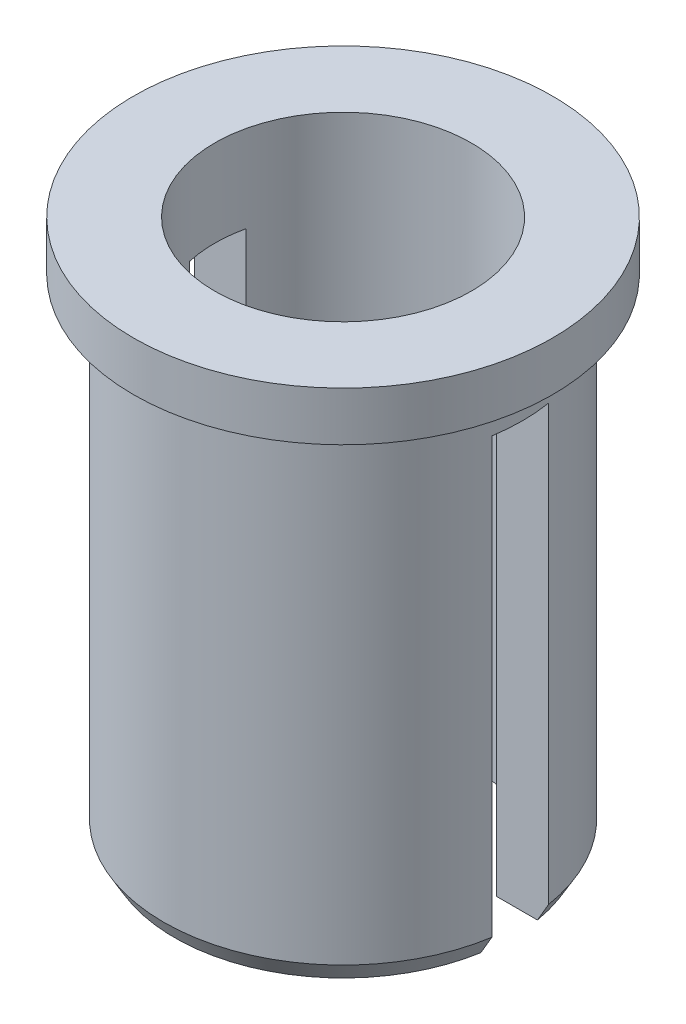
ISO-10303-21;
HEADER;
FILE_DESCRIPTION(('STEP AP214'),'2;1');
FILE_NAME('part.step','',(''),(''),'','','');
FILE_SCHEMA(('AUTOMOTIVE_DESIGN { 1 0 10303 214 1 1 1 1 }'));
ENDSEC;
DATA;
#1=APPLICATION_CONTEXT('core data for automotive mechanical design processes');
#2=APPLICATION_PROTOCOL_DEFINITION('international standard','automotive_design',2000,#1);
#3=PRODUCT_CONTEXT('',#1,'mechanical');
#4=PRODUCT('Part','Part','',(#3));
#5=PRODUCT_RELATED_PRODUCT_CATEGORY('part','',(#4));
#6=PRODUCT_DEFINITION_FORMATION('','',#4);
#7=PRODUCT_DEFINITION_CONTEXT('part definition',#1,'design');
#8=PRODUCT_DEFINITION('design','',#6,#7);
#9=PRODUCT_DEFINITION_SHAPE('','',#8);
#10=(LENGTH_UNIT() NAMED_UNIT(*) SI_UNIT(.MILLI.,.METRE.));
#11=(NAMED_UNIT(*) PLANE_ANGLE_UNIT() SI_UNIT($,.RADIAN.));
#12=(NAMED_UNIT(*) SI_UNIT($,.STERADIAN.) SOLID_ANGLE_UNIT());
#13=UNCERTAINTY_MEASURE_WITH_UNIT(LENGTH_MEASURE(1.E-05),#10,'distance_accuracy_value','');
#14=(GEOMETRIC_REPRESENTATION_CONTEXT(3) GLOBAL_UNCERTAINTY_ASSIGNED_CONTEXT((#13)) GLOBAL_UNIT_ASSIGNED_CONTEXT((#10,
#11,#12)) REPRESENTATION_CONTEXT('',''));
#15=CARTESIAN_POINT('',(0.,0.,0.));
#16=DIRECTION('',(0.,0.,1.));
#17=DIRECTION('',(1.,0.,0.));
#18=AXIS2_PLACEMENT_3D('',#15,#16,#17);
#19=CARTESIAN_POINT('',(0.,-13.8,0.));
#20=DIRECTION('',(0.,1.,0.));
#21=DIRECTION('',(0.,0.,1.));
#22=AXIS2_PLACEMENT_3D('',#19,#20,#21);
#23=CONICAL_SURFACE('',#22,4.75,0.523598775598294);
#24=CARTESIAN_POINT('',(-1.28423683805954,-19.4513351325575,0.75));
#25=CARTESIAN_POINT('',(-1.33017886464985,-19.3825982996046,0.75));
#26=CARTESIAN_POINT('',(-1.37570832509651,-19.3135884762387,0.75));
#27=CARTESIAN_POINT('',(-1.46610163418999,-19.175137146586,0.75));
#28=CARTESIAN_POINT('',(-1.51096550477716,-19.1056956546362,0.75));
#29=CARTESIAN_POINT('',(-1.64479442738056,-18.8969008626601,0.75));
#30=CARTESIAN_POINT('',(-1.73300504599897,-18.757064766779,0.75));
#31=CARTESIAN_POINT('',(-1.90812152725004,-18.4766109031251,0.75));
#32=CARTESIAN_POINT('',(-1.995027586299,-18.335993257482,0.75));
#33=CARTESIAN_POINT('',(-2.16795229702363,-18.0542083321791,0.75));
#34=CARTESIAN_POINT('',(-2.25397092270536,-17.9130410365853,0.75));
#35=CARTESIAN_POINT('',(-2.5050047577619,-17.4990060443665,0.75));
#36=CARTESIAN_POINT('',(-2.66916935709893,-17.2256231891346,0.75));
#37=CARTESIAN_POINT('',(-2.99617735088463,-16.6780733081469,0.75));
#38=CARTESIAN_POINT('',(-3.15902075408227,-16.4039062876003,0.75));
#39=CARTESIAN_POINT('',(-3.48389018613208,-15.8550349690622,0.75));
#40=CARTESIAN_POINT('',(-3.6459160931616,-15.5803305989937,0.75));
#41=CARTESIAN_POINT('',(-3.96940500669167,-15.0305905521903,0.75));
#42=CARTESIAN_POINT('',(-4.13086801266478,-14.7555548751454,0.75));
#43=CARTESIAN_POINT('',(-4.53697088410283,-14.0626668854632,0.75));
#44=CARTESIAN_POINT('',(-4.78135420134329,-13.6446642447714,0.75));
#45=CARTESIAN_POINT('',(-5.26955635605428,-12.8083295952871,0.75));
#46=CARTESIAN_POINT('',(-5.51337519344072,-12.3899975864455,0.75));
#47=CARTESIAN_POINT('',(-6.00056667929082,-11.5532302176554,0.75));
#48=CARTESIAN_POINT('',(-6.24393943330017,-11.1347949191465,0.75));
#49=CARTESIAN_POINT('',(-6.73041145787551,-10.2977660143285,0.75));
#50=CARTESIAN_POINT('',(-6.97351072876016,-9.8791724082046,0.75));
#51=CARTESIAN_POINT('',(-7.21652578765663,-9.46053001867664,0.75));
#52=B_SPLINE_CURVE_WITH_KNOTS('',3,(#24,#25,#26,#27,#28,#29,#30,#31,#32,#33,#34,#35,#36,#37,#38,
#39,#40,#41,#42,#43,#44,#45,#46,#47,#48,#49,#50,#51),.UNSPECIFIED.,.F.,.F.,(4,2,2,2,2,2,2,2,2,2,
2,2,2,4),(0.,0.24802499890014,0.496041803711992,0.992030528695624,1.48794381239315,
1.98387158095398,2.94052137324358,3.89716482541374,4.85394685766425,5.81072978616992,
7.26332826410756,8.71592695844092,10.1681201993516,11.6203117464102),.UNSPECIFIED.);
#53=CARTESIAN_POINT('',(-4.39783123308326,-14.3,0.75));
#54=VERTEX_POINT('',#53);
#55=CARTESIAN_POINT('',(-4.69041575982343,-13.8,0.75));
#56=VERTEX_POINT('',#55);
#57=EDGE_CURVE('E134',#54,#56,#52,.T.);
#58=ORIENTED_EDGE('',*,*,#57,.F.);
#59=CARTESIAN_POINT('',(0.,-14.3,0.));
#60=DIRECTION('',(0.,1.,0.));
#61=DIRECTION('',(0.,0.,1.));
#62=AXIS2_PLACEMENT_3D('',#59,#60,#61);
#63=CIRCLE('',#62,4.46132486540519);
#64=CARTESIAN_POINT('',(4.39783123308326,-14.3,0.75));
#65=VERTEX_POINT('',#64);
#66=EDGE_CURVE('E209',#54,#65,#63,.T.);
#67=ORIENTED_EDGE('',*,*,#66,.T.);
#68=CARTESIAN_POINT('',(7.21652578765663,-9.46053001867664,0.75));
#69=CARTESIAN_POINT('',(6.9734659322663,-9.87924951651519,0.75));
#70=CARTESIAN_POINT('',(6.73032187303945,-10.2979202376059,0.75));
#71=CARTESIAN_POINT('',(6.24376450653096,-11.1350958119217,0.75));
#72=CARTESIAN_POINT('',(6.00035120382188,-11.5536006678045,0.75));
#73=CARTESIAN_POINT('',(5.51316362585562,-12.3903605987162,0.75));
#74=CARTESIAN_POINT('',(5.26938937736666,-12.8086156893275,0.75));
#75=CARTESIAN_POINT('',(4.7812727260108,-13.6448037726104,0.75));
#76=CARTESIAN_POINT('',(4.53693031376675,-14.0627367598122,0.75));
#77=CARTESIAN_POINT('',(4.16972030849921,-14.689265213575,0.75));
#78=CARTESIAN_POINT('',(4.04719279314339,-14.8980599720155,0.75));
#79=CARTESIAN_POINT('',(3.80183883025979,-15.3154728670421,0.75));
#80=CARTESIAN_POINT('',(3.67901238376736,-15.5240910042365,0.75));
#81=CARTESIAN_POINT('',(3.43296571114914,-15.9410828197662,0.75));
#82=CARTESIAN_POINT('',(3.30974550233546,-16.1494565083128,0.75));
#83=CARTESIAN_POINT('',(3.06275335169963,-16.5658804757185,0.75));
#84=CARTESIAN_POINT('',(2.93898140293628,-16.7739307504642,0.75));
#85=CARTESIAN_POINT('',(2.6906282022257,-17.1895899792538,0.75));
#86=CARTESIAN_POINT('',(2.56604683259827,-17.397198863025,0.75));
#87=CARTESIAN_POINT('',(2.31570265096142,-17.8116954132634,0.75));
#88=CARTESIAN_POINT('',(2.18993988030648,-18.0185831046306,0.75));
#89=CARTESIAN_POINT('',(1.99983117908701,-18.328040237046,0.75));
#90=CARTESIAN_POINT('',(1.93621197938865,-18.4310557140922,0.75));
#91=CARTESIAN_POINT('',(1.80832331293152,-18.6366799564475,0.75));
#92=CARTESIAN_POINT('',(1.74405385764415,-18.7392887288871,0.75));
#93=CARTESIAN_POINT('',(1.61463943360087,-18.9439725638588,0.75));
#94=CARTESIAN_POINT('',(1.54949435861725,-19.0460475595095,0.75));
#95=CARTESIAN_POINT('',(1.41792548594459,-19.2493777573853,0.75));
#96=CARTESIAN_POINT('',(1.35150160995945,-19.3506329088717,0.75));
#97=CARTESIAN_POINT('',(1.28423683805954,-19.4513351325575,0.75));
#98=B_SPLINE_CURVE_WITH_KNOTS('',3,(#68,#69,#70,#71,#72,#73,#74,#75,#76,#77,#78,#79,#80,#81,#82,
#83,#84,#85,#86,#87,#88,#89,#90,#91,#92,#93,#94,#95,#96,#97),.UNSPECIFIED.,.F.,.F.,(4,2,2,2,2,2,
2,2,2,2,2,2,2,2,4),(0.,1.45245907931931,2.90489385900428,4.35722583851449,5.80958196031015,
6.53585596640914,7.26212746064302,7.98836745137631,8.71461660456518,9.44097382022508,
10.167305704084,10.5305342114184,10.8937563220278,11.2570229027352,11.6203117960501),.UNSPECIFIED.);
#99=CARTESIAN_POINT('',(4.69041575982343,-13.8,0.75));
#100=VERTEX_POINT('',#99);
#101=EDGE_CURVE('E180',#100,#65,#98,.T.);
#102=ORIENTED_EDGE('',*,*,#101,.F.);
#103=CARTESIAN_POINT('',(0.,-13.8,0.));
#104=DIRECTION('',(0.,1.,0.));
#105=DIRECTION('',(0.,0.,1.));
#106=AXIS2_PLACEMENT_3D('',#103,#104,#105);
#107=CIRCLE('',#106,4.75);
#108=EDGE_CURVE('E213',#56,#100,#107,.T.);
#109=ORIENTED_EDGE('',*,*,#108,.F.);
#110=EDGE_LOOP('',(#58,#67,#102,#109));
#111=FACE_BOUND('',#110,.T.);
#112=ADVANCED_FACE('F39',(#111),#23,.T.);
#113=CARTESIAN_POINT('',(0.,-14.3,4.46132486540519));
#114=DIRECTION('',(0.,-1.,0.));
#115=DIRECTION('',(0.,0.,-1.));
#116=AXIS2_PLACEMENT_3D('',#113,#114,#115);
#117=PLANE('',#116);
#118=DIRECTION('',(-1.,0.,0.));
#119=VECTOR('',#118,1.);
#120=CARTESIAN_POINT('',(-4.75,-14.3,0.75));
#121=LINE('',#120,#119);
#122=CARTESIAN_POINT('',(3.31624787975808,-14.3,0.75));
#123=VERTEX_POINT('',#122);
#124=EDGE_CURVE('E143',#65,#123,#121,.T.);
#125=ORIENTED_EDGE('',*,*,#124,.F.);
#126=ORIENTED_EDGE('',*,*,#66,.F.);
#127=CARTESIAN_POINT('',(-3.31624787975808,-14.3,0.75));
#128=VERTEX_POINT('',#127);
#129=EDGE_CURVE('E148',#128,#54,#121,.T.);
#130=ORIENTED_EDGE('',*,*,#129,.F.);
#131=CARTESIAN_POINT('',(0.,-14.3,0.));
#132=DIRECTION('',(0.,1.,0.));
#133=DIRECTION('',(0.,0.,1.));
#134=AXIS2_PLACEMENT_3D('',#131,#132,#133);
#135=CIRCLE('',#134,3.4);
#136=EDGE_CURVE('E193',#128,#123,#135,.T.);
#137=ORIENTED_EDGE('',*,*,#136,.T.);
#138=EDGE_LOOP('',(#125,#126,#130,#137));
#139=FACE_BOUND('',#138,.T.);
#140=ADVANCED_FACE('F254',(#139),#117,.T.);
#141=CARTESIAN_POINT('',(0.,-1.4,4.75));
#142=DIRECTION('',(0.,1.,0.));
#143=DIRECTION('',(0.,0.,1.));
#144=AXIS2_PLACEMENT_3D('',#141,#142,#143);
#145=PLANE('',#144);
#146=CARTESIAN_POINT('',(0.,-1.4,0.));
#147=DIRECTION('',(0.,1.,0.));
#148=DIRECTION('',(0.,0.,1.));
#149=AXIS2_PLACEMENT_3D('',#146,#147,#148);
#150=CIRCLE('',#149,4.75);
#151=CARTESIAN_POINT('',(0.,-1.4,4.75));
#152=VERTEX_POINT('',#151);
#153=EDGE_CURVE('E216',#152,#152,#150,.T.);
#154=ORIENTED_EDGE('',*,*,#153,.T.);
#155=EDGE_LOOP('',(#154));
#156=FACE_BOUND('',#155,.T.);
#157=CARTESIAN_POINT('',(0.,-1.4,0.));
#158=DIRECTION('',(0.,1.,0.));
#159=DIRECTION('',(0.,0.,1.));
#160=AXIS2_PLACEMENT_3D('',#157,#158,#159);
#161=CIRCLE('',#160,4.65);
#162=CARTESIAN_POINT('',(0.,-1.4,4.65));
#163=VERTEX_POINT('',#162);
#164=EDGE_CURVE('E197',#163,#163,#161,.T.);
#165=ORIENTED_EDGE('',*,*,#164,.F.);
#166=EDGE_LOOP('',(#165));
#167=FACE_BOUND('',#166,.T.);
#168=ADVANCED_FACE('F41',(#156,#167),#145,.T.);
#169=CARTESIAN_POINT('',(0.,0.,0.));
#170=DIRECTION('',(0.,1.,0.));
#171=DIRECTION('',(0.,0.,1.));
#172=AXIS2_PLACEMENT_3D('',#169,#170,#171);
#173=CYLINDRICAL_SURFACE('',#172,4.75);
#174=DIRECTION('',(0.,1.,0.));
#175=VECTOR('',#174,1.);
#176=CARTESIAN_POINT('',(-4.69041575982343,0.,0.75));
#177=LINE('',#176,#175);
#178=CARTESIAN_POINT('',(-4.69041575982343,-2.3,0.75));
#179=VERTEX_POINT('',#178);
#180=EDGE_CURVE('E121',#56,#179,#177,.T.);
#181=ORIENTED_EDGE('',*,*,#180,.F.);
#182=ORIENTED_EDGE('',*,*,#108,.T.);
#183=DIRECTION('',(0.,1.,0.));
#184=VECTOR('',#183,1.);
#185=CARTESIAN_POINT('',(4.69041575982343,0.,0.75));
#186=LINE('',#185,#184);
#187=CARTESIAN_POINT('',(4.69041575982343,-2.3,0.75));
#188=VERTEX_POINT('',#187);
#189=EDGE_CURVE('E185',#188,#100,#186,.F.);
#190=ORIENTED_EDGE('',*,*,#189,.F.);
#191=CARTESIAN_POINT('',(0.,-2.3,0.));
#192=DIRECTION('',(0.,-1.,0.));
#193=DIRECTION('',(0.,0.,-1.));
#194=AXIS2_PLACEMENT_3D('',#191,#192,#193);
#195=CIRCLE('',#194,4.75);
#196=CARTESIAN_POINT('',(4.69041575982343,-2.3,-0.75));
#197=VERTEX_POINT('',#196);
#198=EDGE_CURVE('E127',#188,#197,#195,.F.);
#199=ORIENTED_EDGE('',*,*,#198,.T.);
#200=DIRECTION('',(0.,1.,0.));
#201=VECTOR('',#200,1.);
#202=CARTESIAN_POINT('',(4.69041575982343,0.,-0.75));
#203=LINE('',#202,#201);
#204=CARTESIAN_POINT('',(4.69041575982343,-13.8,-0.75));
#205=VERTEX_POINT('',#204);
#206=EDGE_CURVE('E156',#205,#197,#203,.T.);
#207=ORIENTED_EDGE('',*,*,#206,.F.);
#208=CARTESIAN_POINT('',(-4.69041575982343,-13.8,-0.75));
#209=VERTEX_POINT('',#208);
#210=EDGE_CURVE('E215',#205,#209,#107,.T.);
#211=ORIENTED_EDGE('',*,*,#210,.T.);
#212=DIRECTION('',(0.,1.,0.));
#213=VECTOR('',#212,1.);
#214=CARTESIAN_POINT('',(-4.69041575982343,0.,-0.75));
#215=LINE('',#214,#213);
#216=CARTESIAN_POINT('',(-4.69041575982343,-2.3,-0.75));
#217=VERTEX_POINT('',#216);
#218=EDGE_CURVE('E124',#217,#209,#215,.F.);
#219=ORIENTED_EDGE('',*,*,#218,.F.);
#220=EDGE_CURVE('E116',#217,#179,#195,.F.);
#221=ORIENTED_EDGE('',*,*,#220,.T.);
#222=EDGE_LOOP('',(#181,#182,#190,#199,#207,#211,#219,#221));
#223=FACE_BOUND('',#222,.T.);
#224=ORIENTED_EDGE('',*,*,#153,.F.);
#225=EDGE_LOOP('',(#224));
#226=FACE_BOUND('',#225,.T.);
#227=ADVANCED_FACE('F118',(#223,#226),#173,.T.);
#228=CARTESIAN_POINT('',(-7.21652578765663,-9.46053001867664,-0.75));
#229=CARTESIAN_POINT('',(-6.9734659322663,-9.87924951651519,-0.75));
#230=CARTESIAN_POINT('',(-6.73032187303945,-10.2979202376059,-0.75));
#231=CARTESIAN_POINT('',(-6.24376450653096,-11.1350958119217,-0.75));
#232=CARTESIAN_POINT('',(-6.00035120382188,-11.5536006678045,-0.75));
#233=CARTESIAN_POINT('',(-5.51316362585562,-12.3903605987162,-0.75));
#234=CARTESIAN_POINT('',(-5.26938937736666,-12.8086156893275,-0.75));
#235=CARTESIAN_POINT('',(-4.7812727260108,-13.6448037726104,-0.75));
#236=CARTESIAN_POINT('',(-4.53693031376675,-14.0627367598122,-0.75));
#237=CARTESIAN_POINT('',(-4.16972030849921,-14.689265213575,-0.75));
#238=CARTESIAN_POINT('',(-4.04719279314339,-14.8980599720155,-0.75));
#239=CARTESIAN_POINT('',(-3.80183883025979,-15.3154728670421,-0.75));
#240=CARTESIAN_POINT('',(-3.67901238376736,-15.5240910042365,-0.75));
#241=CARTESIAN_POINT('',(-3.43296571114914,-15.9410828197662,-0.75));
#242=CARTESIAN_POINT('',(-3.30974550233546,-16.1494565083128,-0.75));
#243=CARTESIAN_POINT('',(-3.06275335169963,-16.5658804757185,-0.75));
#244=CARTESIAN_POINT('',(-2.93898140293628,-16.7739307504642,-0.75));
#245=CARTESIAN_POINT('',(-2.6906282022257,-17.1895899792538,-0.75));
#246=CARTESIAN_POINT('',(-2.56604683259827,-17.397198863025,-0.75));
#247=CARTESIAN_POINT('',(-2.31570265096142,-17.8116954132634,-0.75));
#248=CARTESIAN_POINT('',(-2.18993988030648,-18.0185831046306,-0.75));
#249=CARTESIAN_POINT('',(-1.99983117908701,-18.328040237046,-0.75));
#250=CARTESIAN_POINT('',(-1.93621197938865,-18.4310557140922,-0.75));
#251=CARTESIAN_POINT('',(-1.80832331293152,-18.6366799564475,-0.75));
#252=CARTESIAN_POINT('',(-1.74405385764415,-18.7392887288871,-0.75));
#253=CARTESIAN_POINT('',(-1.61463943360087,-18.9439725638588,-0.75));
#254=CARTESIAN_POINT('',(-1.54949435861725,-19.0460475595095,-0.75));
#255=CARTESIAN_POINT('',(-1.41792548594459,-19.2493777573853,-0.75));
#256=CARTESIAN_POINT('',(-1.35150160995945,-19.3506329088717,-0.75));
#257=CARTESIAN_POINT('',(-1.28423683805954,-19.4513351325575,-0.75));
#258=B_SPLINE_CURVE_WITH_KNOTS('',3,(#228,#229,#230,#231,#232,#233,#234,#235,#236,#237,#238,
#239,#240,#241,#242,#243,#244,#245,#246,#247,#248,#249,#250,#251,#252,#253,#254,#255,#256,#257),
.UNSPECIFIED.,.F.,.F.,(4,2,2,2,2,2,2,2,2,2,2,2,2,2,4),(0.,1.45245907931931,2.90489385900428,
4.35722583851449,5.80958196031015,6.53585596640914,7.26212746064302,7.98836745137631,
8.71461660456518,9.44097382022508,10.167305704084,10.5305342114184,10.8937563220278,
11.2570229027352,11.6203117960501),.UNSPECIFIED.);
#259=CARTESIAN_POINT('',(-4.39783123308326,-14.3,-0.75));
#260=VERTEX_POINT('',#259);
#261=EDGE_CURVE('E174',#209,#260,#258,.T.);
#262=ORIENTED_EDGE('',*,*,#261,.F.);
#263=ORIENTED_EDGE('',*,*,#210,.F.);
#264=CARTESIAN_POINT('',(1.28423683805954,-19.4513351325575,-0.75));
#265=CARTESIAN_POINT('',(1.33017886464985,-19.3825982996046,-0.75));
#266=CARTESIAN_POINT('',(1.37570832509651,-19.3135884762387,-0.75));
#267=CARTESIAN_POINT('',(1.46610163418999,-19.175137146586,-0.75));
#268=CARTESIAN_POINT('',(1.51096550477716,-19.1056956546362,-0.75));
#269=CARTESIAN_POINT('',(1.64479442738056,-18.8969008626601,-0.75));
#270=CARTESIAN_POINT('',(1.73300504599897,-18.757064766779,-0.75));
#271=CARTESIAN_POINT('',(1.90812152725004,-18.4766109031251,-0.75));
#272=CARTESIAN_POINT('',(1.995027586299,-18.335993257482,-0.75));
#273=CARTESIAN_POINT('',(2.16795229702363,-18.0542083321791,-0.75));
#274=CARTESIAN_POINT('',(2.25397092270536,-17.9130410365853,-0.75));
#275=CARTESIAN_POINT('',(2.5050047577619,-17.4990060443665,-0.75));
#276=CARTESIAN_POINT('',(2.66916935709893,-17.2256231891346,-0.75));
#277=CARTESIAN_POINT('',(2.99617735088463,-16.6780733081469,-0.75));
#278=CARTESIAN_POINT('',(3.15902075408227,-16.4039062876003,-0.75));
#279=CARTESIAN_POINT('',(3.48389018613208,-15.8550349690622,-0.75));
#280=CARTESIAN_POINT('',(3.6459160931616,-15.5803305989937,-0.75));
#281=CARTESIAN_POINT('',(3.96940500669167,-15.0305905521903,-0.75));
#282=CARTESIAN_POINT('',(4.13086801266478,-14.7555548751454,-0.75));
#283=CARTESIAN_POINT('',(4.53697088410283,-14.0626668854632,-0.75));
#284=CARTESIAN_POINT('',(4.78135420134329,-13.6446642447714,-0.75));
#285=CARTESIAN_POINT('',(5.26955635605428,-12.8083295952871,-0.75));
#286=CARTESIAN_POINT('',(5.51337519344072,-12.3899975864455,-0.75));
#287=CARTESIAN_POINT('',(6.00056667929082,-11.5532302176554,-0.75));
#288=CARTESIAN_POINT('',(6.24393943330017,-11.1347949191465,-0.75));
#289=CARTESIAN_POINT('',(6.73041145787551,-10.2977660143285,-0.75));
#290=CARTESIAN_POINT('',(6.97351072876016,-9.8791724082046,-0.75));
#291=CARTESIAN_POINT('',(7.21652578765663,-9.46053001867664,-0.75));
#292=B_SPLINE_CURVE_WITH_KNOTS('',3,(#264,#265,#266,#267,#268,#269,#270,#271,#272,#273,#274,
#275,#276,#277,#278,#279,#280,#281,#282,#283,#284,#285,#286,#287,#288,#289,#290,#291),
.UNSPECIFIED.,.F.,.F.,(4,2,2,2,2,2,2,2,2,2,2,2,2,4),(0.,0.24802499890014,0.496041803711992,
0.992030528695624,1.48794381239315,1.98387158095398,2.94052137324358,3.89716482541374,
4.85394685766425,5.81072978616992,7.26332826410756,8.71592695844092,10.1681201993516,
11.6203117464102),.UNSPECIFIED.);
#293=CARTESIAN_POINT('',(4.39783123308326,-14.3,-0.75));
#294=VERTEX_POINT('',#293);
#295=EDGE_CURVE('E126',#294,#205,#292,.T.);
#296=ORIENTED_EDGE('',*,*,#295,.F.);
#297=EDGE_CURVE('E212',#294,#260,#63,.T.);
#298=ORIENTED_EDGE('',*,*,#297,.T.);
#299=EDGE_LOOP('',(#262,#263,#296,#298));
#300=FACE_BOUND('',#299,.T.);
#301=ADVANCED_FACE('F158',(#300),#23,.T.);
#302=DIRECTION('',(1.,0.,0.));
#303=VECTOR('',#302,1.);
#304=CARTESIAN_POINT('',(-4.75,-14.3,-0.75));
#305=LINE('',#304,#303);
#306=CARTESIAN_POINT('',(-3.31624787975808,-14.3,-0.75));
#307=VERTEX_POINT('',#306);
#308=EDGE_CURVE('E147',#260,#307,#305,.T.);
#309=ORIENTED_EDGE('',*,*,#308,.F.);
#310=ORIENTED_EDGE('',*,*,#297,.F.);
#311=CARTESIAN_POINT('',(3.31624787975808,-14.3,-0.75));
#312=VERTEX_POINT('',#311);
#313=EDGE_CURVE('E145',#312,#294,#305,.T.);
#314=ORIENTED_EDGE('',*,*,#313,.F.);
#315=EDGE_CURVE('E196',#312,#307,#135,.T.);
#316=ORIENTED_EDGE('',*,*,#315,.T.);
#317=EDGE_LOOP('',(#309,#310,#314,#316));
#318=FACE_BOUND('',#317,.T.);
#319=ADVANCED_FACE('F235',(#318),#117,.T.);
#320=CARTESIAN_POINT('',(0.,0.,5.55));
#321=DIRECTION('',(0.,1.,0.));
#322=DIRECTION('',(0.,0.,1.));
#323=AXIS2_PLACEMENT_3D('',#320,#321,#322);
#324=PLANE('',#323);
#325=CARTESIAN_POINT('',(0.,0.,0.));
#326=DIRECTION('',(0.,1.,0.));
#327=DIRECTION('',(0.,0.,1.));
#328=AXIS2_PLACEMENT_3D('',#325,#326,#327);
#329=CIRCLE('',#328,3.4);
#330=CARTESIAN_POINT('',(0.,0.,3.4));
#331=VERTEX_POINT('',#330);
#332=EDGE_CURVE('E135',#331,#331,#329,.T.);
#333=ORIENTED_EDGE('',*,*,#332,.F.);
#334=EDGE_LOOP('',(#333));
#335=FACE_BOUND('',#334,.T.);
#336=CARTESIAN_POINT('',(0.,0.,0.));
#337=DIRECTION('',(0.,1.,0.));
#338=DIRECTION('',(0.,0.,1.));
#339=AXIS2_PLACEMENT_3D('',#336,#337,#338);
#340=CIRCLE('',#339,5.55);
#341=CARTESIAN_POINT('',(0.,0.,5.55));
#342=VERTEX_POINT('',#341);
#343=EDGE_CURVE('E206',#342,#342,#340,.T.);
#344=ORIENTED_EDGE('',*,*,#343,.T.);
#345=EDGE_LOOP('',(#344));
#346=FACE_BOUND('',#345,.T.);
#347=ADVANCED_FACE('F272',(#335,#346),#324,.T.);
#348=CARTESIAN_POINT('',(0.,0.,0.));
#349=DIRECTION('',(0.,1.,0.));
#350=DIRECTION('',(0.,0.,1.));
#351=AXIS2_PLACEMENT_3D('',#348,#349,#350);
#352=CYLINDRICAL_SURFACE('',#351,5.55);
#353=CARTESIAN_POINT('',(0.,-1.3,0.));
#354=DIRECTION('',(0.,1.,0.));
#355=DIRECTION('',(0.,0.,1.));
#356=AXIS2_PLACEMENT_3D('',#353,#354,#355);
#357=CIRCLE('',#356,5.55);
#358=CARTESIAN_POINT('',(0.,-1.3,5.55));
#359=VERTEX_POINT('',#358);
#360=EDGE_CURVE('E203',#359,#359,#357,.T.);
#361=ORIENTED_EDGE('',*,*,#360,.T.);
#362=EDGE_LOOP('',(#361));
#363=FACE_BOUND('',#362,.T.);
#364=ORIENTED_EDGE('',*,*,#343,.F.);
#365=EDGE_LOOP('',(#364));
#366=FACE_BOUND('',#365,.T.);
#367=ADVANCED_FACE('F291',(#363,#366),#352,.T.);
#368=CARTESIAN_POINT('',(0.,-1.3,4.65));
#369=DIRECTION('',(0.,-1.,0.));
#370=DIRECTION('',(0.,0.,-1.));
#371=AXIS2_PLACEMENT_3D('',#368,#369,#370);
#372=PLANE('',#371);
#373=CARTESIAN_POINT('',(0.,-1.3,0.));
#374=DIRECTION('',(0.,1.,0.));
#375=DIRECTION('',(0.,0.,1.));
#376=AXIS2_PLACEMENT_3D('',#373,#374,#375);
#377=CIRCLE('',#376,4.65);
#378=CARTESIAN_POINT('',(0.,-1.3,4.65));
#379=VERTEX_POINT('',#378);
#380=EDGE_CURVE('E200',#379,#379,#377,.T.);
#381=ORIENTED_EDGE('',*,*,#380,.T.);
#382=EDGE_LOOP('',(#381));
#383=FACE_BOUND('',#382,.T.);
#384=ORIENTED_EDGE('',*,*,#360,.F.);
#385=EDGE_LOOP('',(#384));
#386=FACE_BOUND('',#385,.T.);
#387=ADVANCED_FACE('F286',(#383,#386),#372,.T.);
#388=CARTESIAN_POINT('',(0.,0.,0.));
#389=DIRECTION('',(0.,1.,0.));
#390=DIRECTION('',(0.,0.,1.));
#391=AXIS2_PLACEMENT_3D('',#388,#389,#390);
#392=CYLINDRICAL_SURFACE('',#391,4.65);
#393=ORIENTED_EDGE('',*,*,#164,.T.);
#394=EDGE_LOOP('',(#393));
#395=FACE_BOUND('',#394,.T.);
#396=ORIENTED_EDGE('',*,*,#380,.F.);
#397=EDGE_LOOP('',(#396));
#398=FACE_BOUND('',#397,.T.);
#399=ADVANCED_FACE('F283',(#395,#398),#392,.T.);
#400=CARTESIAN_POINT('',(0.,0.,0.));
#401=DIRECTION('',(0.,1.,0.));
#402=DIRECTION('',(0.,0.,1.));
#403=AXIS2_PLACEMENT_3D('',#400,#401,#402);
#404=CYLINDRICAL_SURFACE('',#403,3.4);
#405=ORIENTED_EDGE('',*,*,#136,.F.);
#406=DIRECTION('',(0.,1.,0.));
#407=VECTOR('',#406,1.);
#408=CARTESIAN_POINT('',(-3.31624787975808,0.,0.75));
#409=LINE('',#408,#407);
#410=CARTESIAN_POINT('',(-3.31624787975808,-2.3,0.75));
#411=VERTEX_POINT('',#410);
#412=EDGE_CURVE('E14',#128,#411,#409,.T.);
#413=ORIENTED_EDGE('',*,*,#412,.T.);
#414=CARTESIAN_POINT('',(0.,-2.3,0.));
#415=DIRECTION('',(0.,-1.,0.));
#416=DIRECTION('',(0.,0.,-1.));
#417=AXIS2_PLACEMENT_3D('',#414,#415,#416);
#418=CIRCLE('',#417,3.4);
#419=CARTESIAN_POINT('',(-3.31624787975808,-2.3,-0.75));
#420=VERTEX_POINT('',#419);
#421=EDGE_CURVE('E139',#420,#411,#418,.F.);
#422=ORIENTED_EDGE('',*,*,#421,.F.);
#423=DIRECTION('',(0.,1.,0.));
#424=VECTOR('',#423,1.);
#425=CARTESIAN_POINT('',(-3.31624787975808,0.,-0.75));
#426=LINE('',#425,#424);
#427=EDGE_CURVE('E47',#420,#307,#426,.F.);
#428=ORIENTED_EDGE('',*,*,#427,.T.);
#429=ORIENTED_EDGE('',*,*,#315,.F.);
#430=DIRECTION('',(0.,1.,0.));
#431=VECTOR('',#430,1.);
#432=CARTESIAN_POINT('',(3.31624787975808,0.,-0.75));
#433=LINE('',#432,#431);
#434=CARTESIAN_POINT('',(3.31624787975808,-2.3,-0.75));
#435=VERTEX_POINT('',#434);
#436=EDGE_CURVE('E221',#312,#435,#433,.T.);
#437=ORIENTED_EDGE('',*,*,#436,.T.);
#438=CARTESIAN_POINT('',(3.31624787975808,-2.3,0.75));
#439=VERTEX_POINT('',#438);
#440=EDGE_CURVE('E219',#439,#435,#418,.F.);
#441=ORIENTED_EDGE('',*,*,#440,.F.);
#442=DIRECTION('',(0.,1.,0.));
#443=VECTOR('',#442,1.);
#444=CARTESIAN_POINT('',(3.31624787975808,0.,0.75));
#445=LINE('',#444,#443);
#446=EDGE_CURVE('E224',#439,#123,#445,.F.);
#447=ORIENTED_EDGE('',*,*,#446,.T.);
#448=EDGE_LOOP('',(#405,#413,#422,#428,#429,#437,#441,#447));
#449=FACE_BOUND('',#448,.T.);
#450=ORIENTED_EDGE('',*,*,#332,.T.);
#451=EDGE_LOOP('',(#450));
#452=FACE_BOUND('',#451,.T.);
#453=ADVANCED_FACE('F171',(#449,#452),#404,.F.);
#454=CARTESIAN_POINT('',(0.,-2.3,4.65));
#455=DIRECTION('',(0.,-1.,0.));
#456=DIRECTION('',(0.,0.,-1.));
#457=AXIS2_PLACEMENT_3D('',#454,#455,#456);
#458=PLANE('',#457);
#459=DIRECTION('',(1.,0.,0.));
#460=VECTOR('',#459,1.);
#461=CARTESIAN_POINT('',(-4.75,-2.3,0.75));
#462=LINE('',#461,#460);
#463=EDGE_CURVE('E62',#439,#188,#462,.T.);
#464=ORIENTED_EDGE('',*,*,#463,.F.);
#465=ORIENTED_EDGE('',*,*,#440,.T.);
#466=DIRECTION('',(-1.,0.,0.));
#467=VECTOR('',#466,1.);
#468=CARTESIAN_POINT('',(-4.75,-2.3,-0.75));
#469=LINE('',#468,#467);
#470=EDGE_CURVE('E141',#197,#435,#469,.T.);
#471=ORIENTED_EDGE('',*,*,#470,.F.);
#472=ORIENTED_EDGE('',*,*,#198,.F.);
#473=EDGE_LOOP('',(#464,#465,#471,#472));
#474=FACE_BOUND('',#473,.T.);
#475=ADVANCED_FACE('F248',(#474),#458,.T.);
#476=CARTESIAN_POINT('',(-4.75,8.31769203083567,-0.75));
#477=DIRECTION('',(0.,0.,-1.));
#478=DIRECTION('',(-1.,0.,0.));
#479=AXIS2_PLACEMENT_3D('',#476,#477,#478);
#480=PLANE('',#479);
#481=ORIENTED_EDGE('',*,*,#206,.T.);
#482=ORIENTED_EDGE('',*,*,#470,.T.);
#483=ORIENTED_EDGE('',*,*,#436,.F.);
#484=ORIENTED_EDGE('',*,*,#313,.T.);
#485=ORIENTED_EDGE('',*,*,#295,.T.);
#486=EDGE_LOOP('',(#481,#482,#483,#484,#485));
#487=FACE_BOUND('',#486,.T.);
#488=ADVANCED_FACE('F167',(#487),#480,.F.);
#489=CARTESIAN_POINT('',(-4.75,8.31769203083567,0.75));
#490=DIRECTION('',(0.,0.,1.));
#491=DIRECTION('',(1.,0.,0.));
#492=AXIS2_PLACEMENT_3D('',#489,#490,#491);
#493=PLANE('',#492);
#494=ORIENTED_EDGE('',*,*,#189,.T.);
#495=ORIENTED_EDGE('',*,*,#101,.T.);
#496=ORIENTED_EDGE('',*,*,#124,.T.);
#497=ORIENTED_EDGE('',*,*,#446,.F.);
#498=ORIENTED_EDGE('',*,*,#463,.T.);
#499=EDGE_LOOP('',(#494,#495,#496,#497,#498));
#500=FACE_BOUND('',#499,.T.);
#501=ADVANCED_FACE('F168',(#500),#493,.F.);
#502=ORIENTED_EDGE('',*,*,#180,.T.);
#503=EDGE_CURVE('E132',#179,#411,#462,.T.);
#504=ORIENTED_EDGE('',*,*,#503,.T.);
#505=ORIENTED_EDGE('',*,*,#412,.F.);
#506=ORIENTED_EDGE('',*,*,#129,.T.);
#507=ORIENTED_EDGE('',*,*,#57,.T.);
#508=EDGE_LOOP('',(#502,#504,#505,#506,#507));
#509=FACE_BOUND('',#508,.T.);
#510=ADVANCED_FACE('F131',(#509),#493,.F.);
#511=ORIENTED_EDGE('',*,*,#218,.T.);
#512=ORIENTED_EDGE('',*,*,#261,.T.);
#513=ORIENTED_EDGE('',*,*,#308,.T.);
#514=ORIENTED_EDGE('',*,*,#427,.F.);
#515=EDGE_CURVE('E54',#420,#217,#469,.T.);
#516=ORIENTED_EDGE('',*,*,#515,.T.);
#517=EDGE_LOOP('',(#511,#512,#513,#514,#516));
#518=FACE_BOUND('',#517,.T.);
#519=ADVANCED_FACE('F161',(#518),#480,.F.);
#520=ORIENTED_EDGE('',*,*,#515,.F.);
#521=ORIENTED_EDGE('',*,*,#421,.T.);
#522=ORIENTED_EDGE('',*,*,#503,.F.);
#523=ORIENTED_EDGE('',*,*,#220,.F.);
#524=EDGE_LOOP('',(#520,#521,#522,#523));
#525=FACE_BOUND('',#524,.T.);
#526=ADVANCED_FACE('F137',(#525),#458,.T.);
#527=CLOSED_SHELL('',(#112,#140,#168,#227,#301,#319,#347,#367,#387,#399,#453,#475,#488,#501,
#510,#519,#526));
#528=MANIFOLD_SOLID_BREP('B2',#527);
#529=ADVANCED_BREP_SHAPE_REPRESENTATION('',(#18,#528),#14);
#530=SHAPE_DEFINITION_REPRESENTATION(#9,#529);
ENDSEC;
END-ISO-10303-21;
